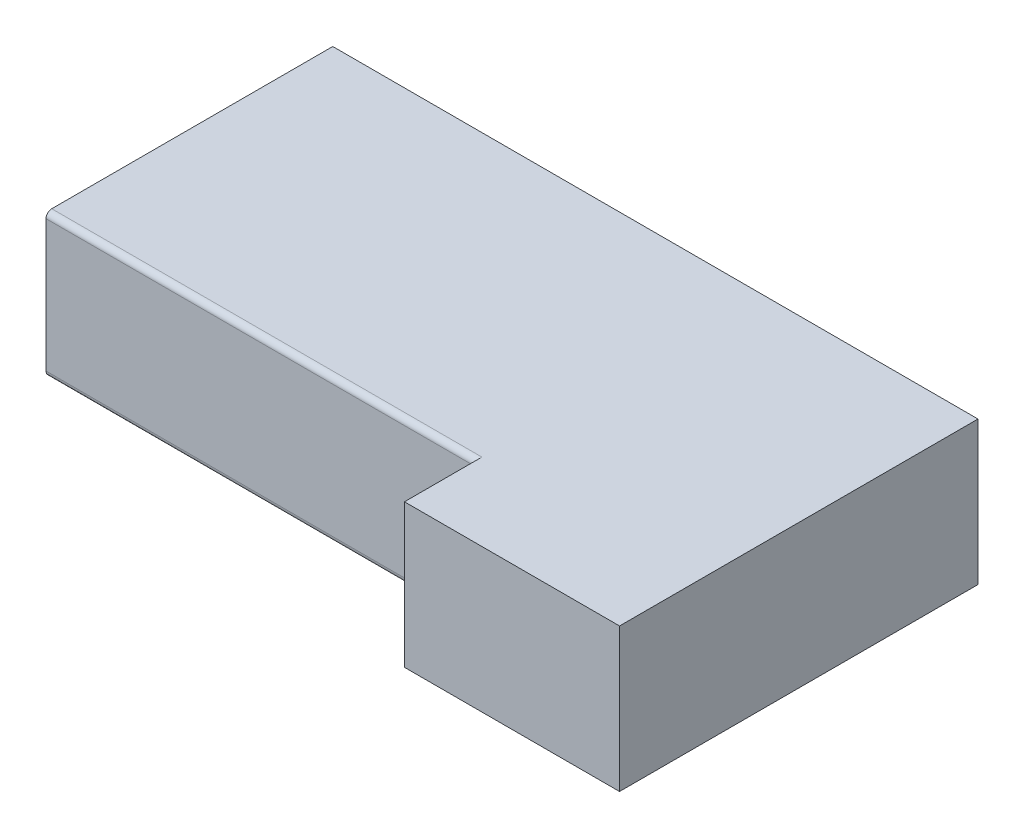
ISO-10303-21;
HEADER;
FILE_DESCRIPTION(('STEP AP214'),'2;1');
FILE_NAME('part.step','',(''),(''),'','','');
FILE_SCHEMA(('AUTOMOTIVE_DESIGN { 1 0 10303 214 1 1 1 1 }'));
ENDSEC;
DATA;
#1=APPLICATION_CONTEXT('core data for automotive mechanical design processes');
#2=APPLICATION_PROTOCOL_DEFINITION('international standard','automotive_design',2000,#1);
#3=PRODUCT_CONTEXT('',#1,'mechanical');
#4=PRODUCT('Part','Part','',(#3));
#5=PRODUCT_RELATED_PRODUCT_CATEGORY('part','',(#4));
#6=PRODUCT_DEFINITION_FORMATION('','',#4);
#7=PRODUCT_DEFINITION_CONTEXT('part definition',#1,'design');
#8=PRODUCT_DEFINITION('design','',#6,#7);
#9=PRODUCT_DEFINITION_SHAPE('','',#8);
#10=(LENGTH_UNIT() NAMED_UNIT(*) SI_UNIT(.MILLI.,.METRE.));
#11=(NAMED_UNIT(*) PLANE_ANGLE_UNIT() SI_UNIT($,.RADIAN.));
#12=(NAMED_UNIT(*) SI_UNIT($,.STERADIAN.) SOLID_ANGLE_UNIT());
#13=UNCERTAINTY_MEASURE_WITH_UNIT(LENGTH_MEASURE(1.E-05),#10,'distance_accuracy_value','');
#14=(GEOMETRIC_REPRESENTATION_CONTEXT(3) GLOBAL_UNCERTAINTY_ASSIGNED_CONTEXT((#13)) GLOBAL_UNIT_ASSIGNED_CONTEXT((#10,
#11,#12)) REPRESENTATION_CONTEXT('',''));
#15=CARTESIAN_POINT('',(0.,0.,0.));
#16=DIRECTION('',(0.,0.,1.));
#17=DIRECTION('',(1.,0.,0.));
#18=AXIS2_PLACEMENT_3D('',#15,#16,#17);
#19=CARTESIAN_POINT('',(-28.575,6.35,12.7));
#20=DIRECTION('',(0.,0.,-1.));
#21=DIRECTION('',(-1.,0.,0.));
#22=AXIS2_PLACEMENT_3D('',#19,#20,#21);
#23=PLANE('',#22);
#24=DIRECTION('',(0.,-1.,0.));
#25=VECTOR('',#24,1.);
#26=CARTESIAN_POINT('',(-28.575,6.35,12.7));
#27=LINE('',#26,#25);
#28=CARTESIAN_POINT('',(-28.575,5.842,12.7));
#29=VERTEX_POINT('',#28);
#30=CARTESIAN_POINT('',(-28.575,-5.842,12.7));
#31=VERTEX_POINT('',#30);
#32=EDGE_CURVE('E137',#29,#31,#27,.T.);
#33=ORIENTED_EDGE('',*,*,#32,.T.);
#34=DIRECTION('',(1.,0.,0.));
#35=VECTOR('',#34,1.);
#36=CARTESIAN_POINT('',(-28.575,-5.842,12.7));
#37=LINE('',#36,#35);
#38=CARTESIAN_POINT('',(9.525,-5.842,12.7));
#39=VERTEX_POINT('',#38);
#40=EDGE_CURVE('E151',#31,#39,#37,.T.);
#41=ORIENTED_EDGE('',*,*,#40,.T.);
#42=DIRECTION('',(0.,-1.,0.));
#43=VECTOR('',#42,1.);
#44=CARTESIAN_POINT('',(9.525,6.35,12.7));
#45=LINE('',#44,#43);
#46=CARTESIAN_POINT('',(9.525,5.842,12.7));
#47=VERTEX_POINT('',#46);
#48=EDGE_CURVE('E123',#47,#39,#45,.T.);
#49=ORIENTED_EDGE('',*,*,#48,.F.);
#50=DIRECTION('',(1.,0.,0.));
#51=VECTOR('',#50,1.);
#52=CARTESIAN_POINT('',(-28.575,5.842,12.7));
#53=LINE('',#52,#51);
#54=EDGE_CURVE('E149',#47,#29,#53,.F.);
#55=ORIENTED_EDGE('',*,*,#54,.T.);
#56=EDGE_LOOP('',(#33,#41,#49,#55));
#57=FACE_BOUND('',#56,.T.);
#58=ADVANCED_FACE('F33',(#57),#23,.F.);
#59=CARTESIAN_POINT('',(28.575,6.35,-12.7));
#60=DIRECTION('',(-1.,0.,0.));
#61=DIRECTION('',(0.,0.,1.));
#62=AXIS2_PLACEMENT_3D('',#59,#60,#61);
#63=PLANE('',#62);
#64=DIRECTION('',(0.,0.,-1.));
#65=VECTOR('',#64,1.);
#66=CARTESIAN_POINT('',(28.575,-6.35,-12.7));
#67=LINE('',#66,#65);
#68=CARTESIAN_POINT('',(28.575,-6.35,19.05));
#69=VERTEX_POINT('',#68);
#70=CARTESIAN_POINT('',(28.575,-6.35,-12.7));
#71=VERTEX_POINT('',#70);
#72=EDGE_CURVE('E132',#69,#71,#67,.T.);
#73=ORIENTED_EDGE('',*,*,#72,.T.);
#74=DIRECTION('',(0.,-1.,0.));
#75=VECTOR('',#74,1.);
#76=CARTESIAN_POINT('',(28.575,6.35,-12.7));
#77=LINE('',#76,#75);
#78=CARTESIAN_POINT('',(28.575,6.35,-12.7));
#79=VERTEX_POINT('',#78);
#80=EDGE_CURVE('E108',#79,#71,#77,.T.);
#81=ORIENTED_EDGE('',*,*,#80,.F.);
#82=DIRECTION('',(0.,0.,-1.));
#83=VECTOR('',#82,1.);
#84=CARTESIAN_POINT('',(28.575,6.35,-12.7));
#85=LINE('',#84,#83);
#86=CARTESIAN_POINT('',(28.575,6.35,19.05));
#87=VERTEX_POINT('',#86);
#88=EDGE_CURVE('E101',#87,#79,#85,.T.);
#89=ORIENTED_EDGE('',*,*,#88,.F.);
#90=DIRECTION('',(0.,1.,0.));
#91=VECTOR('',#90,1.);
#92=CARTESIAN_POINT('',(28.575,6.35,19.05));
#93=LINE('',#92,#91);
#94=EDGE_CURVE('E106',#69,#87,#93,.T.);
#95=ORIENTED_EDGE('',*,*,#94,.F.);
#96=EDGE_LOOP('',(#73,#81,#89,#95));
#97=FACE_BOUND('',#96,.T.);
#98=ADVANCED_FACE('F104',(#97),#63,.F.);
#99=CARTESIAN_POINT('',(-28.575,6.35,-12.7));
#100=DIRECTION('',(0.,0.,1.));
#101=DIRECTION('',(1.,0.,0.));
#102=AXIS2_PLACEMENT_3D('',#99,#100,#101);
#103=PLANE('',#102);
#104=DIRECTION('',(-1.,0.,0.));
#105=VECTOR('',#104,1.);
#106=CARTESIAN_POINT('',(-28.575,-6.35,-12.7));
#107=LINE('',#106,#105);
#108=CARTESIAN_POINT('',(-28.575,-6.35,-12.7));
#109=VERTEX_POINT('',#108);
#110=EDGE_CURVE('E139',#71,#109,#107,.T.);
#111=ORIENTED_EDGE('',*,*,#110,.T.);
#112=DIRECTION('',(0.,-1.,0.));
#113=VECTOR('',#112,1.);
#114=CARTESIAN_POINT('',(-28.575,6.35,-12.7));
#115=LINE('',#114,#113);
#116=CARTESIAN_POINT('',(-28.575,6.35,-12.7));
#117=VERTEX_POINT('',#116);
#118=EDGE_CURVE('E145',#117,#109,#115,.T.);
#119=ORIENTED_EDGE('',*,*,#118,.F.);
#120=DIRECTION('',(-1.,0.,0.));
#121=VECTOR('',#120,1.);
#122=CARTESIAN_POINT('',(-28.575,6.35,-12.7));
#123=LINE('',#122,#121);
#124=EDGE_CURVE('E110',#79,#117,#123,.T.);
#125=ORIENTED_EDGE('',*,*,#124,.F.);
#126=ORIENTED_EDGE('',*,*,#80,.T.);
#127=EDGE_LOOP('',(#111,#119,#125,#126));
#128=FACE_BOUND('',#127,.T.);
#129=ADVANCED_FACE('F175',(#128),#103,.F.);
#130=CARTESIAN_POINT('',(-28.575,6.35,-12.7));
#131=DIRECTION('',(1.,0.,0.));
#132=DIRECTION('',(0.,0.,-1.));
#133=AXIS2_PLACEMENT_3D('',#130,#131,#132);
#134=PLANE('',#133);
#135=DIRECTION('',(0.,0.,1.));
#136=VECTOR('',#135,1.);
#137=CARTESIAN_POINT('',(-28.575,-6.35,-12.7));
#138=LINE('',#137,#136);
#139=CARTESIAN_POINT('',(-28.575,-6.35,12.192));
#140=VERTEX_POINT('',#139);
#141=EDGE_CURVE('E111',#109,#140,#138,.T.);
#142=ORIENTED_EDGE('',*,*,#141,.T.);
#143=CARTESIAN_POINT('',(-28.575,-5.842,12.192));
#144=DIRECTION('',(1.,0.,0.));
#145=DIRECTION('',(0.,0.,-1.));
#146=AXIS2_PLACEMENT_3D('',#143,#144,#145);
#147=CIRCLE('',#146,0.508);
#148=EDGE_CURVE('E157',#140,#31,#147,.F.);
#149=ORIENTED_EDGE('',*,*,#148,.T.);
#150=ORIENTED_EDGE('',*,*,#32,.F.);
#151=CARTESIAN_POINT('',(-28.575,5.842,12.192));
#152=DIRECTION('',(1.,0.,0.));
#153=DIRECTION('',(0.,0.,-1.));
#154=AXIS2_PLACEMENT_3D('',#151,#152,#153);
#155=CIRCLE('',#154,0.508);
#156=CARTESIAN_POINT('',(-28.575,6.35,12.192));
#157=VERTEX_POINT('',#156);
#158=EDGE_CURVE('E55',#29,#157,#155,.F.);
#159=ORIENTED_EDGE('',*,*,#158,.T.);
#160=DIRECTION('',(0.,0.,1.));
#161=VECTOR('',#160,1.);
#162=CARTESIAN_POINT('',(-28.575,6.35,-12.7));
#163=LINE('',#162,#161);
#164=EDGE_CURVE('E135',#117,#157,#163,.T.);
#165=ORIENTED_EDGE('',*,*,#164,.F.);
#166=ORIENTED_EDGE('',*,*,#118,.T.);
#167=EDGE_LOOP('',(#142,#149,#150,#159,#165,#166));
#168=FACE_BOUND('',#167,.T.);
#169=ADVANCED_FACE('F172',(#168),#134,.F.);
#170=CARTESIAN_POINT('',(0.,6.35,0.));
#171=DIRECTION('',(0.,1.,0.));
#172=DIRECTION('',(0.,0.,1.));
#173=AXIS2_PLACEMENT_3D('',#170,#171,#172);
#174=PLANE('',#173);
#175=ORIENTED_EDGE('',*,*,#164,.T.);
#176=DIRECTION('',(1.,0.,0.));
#177=VECTOR('',#176,1.);
#178=CARTESIAN_POINT('',(9.525,6.35,12.192));
#179=LINE('',#178,#177);
#180=CARTESIAN_POINT('',(9.525,6.35,12.192));
#181=VERTEX_POINT('',#180);
#182=EDGE_CURVE('E159',#157,#181,#179,.T.);
#183=ORIENTED_EDGE('',*,*,#182,.T.);
#184=DIRECTION('',(0.,0.,-1.));
#185=VECTOR('',#184,1.);
#186=CARTESIAN_POINT('',(9.525,6.35,19.05));
#187=LINE('',#186,#185);
#188=CARTESIAN_POINT('',(9.525,6.35,19.05));
#189=VERTEX_POINT('',#188);
#190=EDGE_CURVE('E47',#189,#181,#187,.T.);
#191=ORIENTED_EDGE('',*,*,#190,.F.);
#192=DIRECTION('',(-1.,0.,0.));
#193=VECTOR('',#192,1.);
#194=CARTESIAN_POINT('',(28.575,6.35,19.05));
#195=LINE('',#194,#193);
#196=EDGE_CURVE('E113',#87,#189,#195,.T.);
#197=ORIENTED_EDGE('',*,*,#196,.F.);
#198=ORIENTED_EDGE('',*,*,#88,.T.);
#199=ORIENTED_EDGE('',*,*,#124,.T.);
#200=EDGE_LOOP('',(#175,#183,#191,#197,#198,#199));
#201=FACE_BOUND('',#200,.T.);
#202=ADVANCED_FACE('F114',(#201),#174,.T.);
#203=CARTESIAN_POINT('',(0.,-6.35,0.));
#204=DIRECTION('',(0.,1.,0.));
#205=DIRECTION('',(0.,0.,1.));
#206=AXIS2_PLACEMENT_3D('',#203,#204,#205);
#207=PLANE('',#206);
#208=DIRECTION('',(0.,0.,-1.));
#209=VECTOR('',#208,1.);
#210=CARTESIAN_POINT('',(9.525,-6.35,19.05));
#211=LINE('',#210,#209);
#212=CARTESIAN_POINT('',(9.525,-6.35,19.05));
#213=VERTEX_POINT('',#212);
#214=CARTESIAN_POINT('',(9.525,-6.35,12.192));
#215=VERTEX_POINT('',#214);
#216=EDGE_CURVE('E129',#213,#215,#211,.T.);
#217=ORIENTED_EDGE('',*,*,#216,.T.);
#218=DIRECTION('',(1.,0.,0.));
#219=VECTOR('',#218,1.);
#220=CARTESIAN_POINT('',(0.,-6.35,12.192));
#221=LINE('',#220,#219);
#222=EDGE_CURVE('E154',#215,#140,#221,.F.);
#223=ORIENTED_EDGE('',*,*,#222,.T.);
#224=ORIENTED_EDGE('',*,*,#141,.F.);
#225=ORIENTED_EDGE('',*,*,#110,.F.);
#226=ORIENTED_EDGE('',*,*,#72,.F.);
#227=DIRECTION('',(1.,0.,0.));
#228=VECTOR('',#227,1.);
#229=CARTESIAN_POINT('',(28.575,-6.35,19.05));
#230=LINE('',#229,#228);
#231=EDGE_CURVE('E122',#213,#69,#230,.T.);
#232=ORIENTED_EDGE('',*,*,#231,.F.);
#233=EDGE_LOOP('',(#217,#223,#224,#225,#226,#232));
#234=FACE_BOUND('',#233,.T.);
#235=ADVANCED_FACE('F171',(#234),#207,.F.);
#236=CARTESIAN_POINT('',(9.525,6.35,19.05));
#237=DIRECTION('',(1.,0.,0.));
#238=DIRECTION('',(0.,0.,-1.));
#239=AXIS2_PLACEMENT_3D('',#236,#237,#238);
#240=PLANE('',#239);
#241=ORIENTED_EDGE('',*,*,#190,.T.);
#242=CARTESIAN_POINT('',(9.525,5.842,12.192));
#243=DIRECTION('',(1.,0.,0.));
#244=DIRECTION('',(0.,0.,-1.));
#245=AXIS2_PLACEMENT_3D('',#242,#243,#244);
#246=CIRCLE('',#245,0.508);
#247=EDGE_CURVE('E11',#181,#47,#246,.T.);
#248=ORIENTED_EDGE('',*,*,#247,.T.);
#249=ORIENTED_EDGE('',*,*,#48,.T.);
#250=CARTESIAN_POINT('',(9.525,-5.842,12.192));
#251=DIRECTION('',(1.,0.,0.));
#252=DIRECTION('',(0.,0.,-1.));
#253=AXIS2_PLACEMENT_3D('',#250,#251,#252);
#254=CIRCLE('',#253,0.508);
#255=EDGE_CURVE('E41',#39,#215,#254,.T.);
#256=ORIENTED_EDGE('',*,*,#255,.T.);
#257=ORIENTED_EDGE('',*,*,#216,.F.);
#258=DIRECTION('',(0.,-1.,0.));
#259=VECTOR('',#258,1.);
#260=CARTESIAN_POINT('',(9.525,6.35,19.05));
#261=LINE('',#260,#259);
#262=EDGE_CURVE('E117',#189,#213,#261,.T.);
#263=ORIENTED_EDGE('',*,*,#262,.F.);
#264=EDGE_LOOP('',(#241,#248,#249,#256,#257,#263));
#265=FACE_BOUND('',#264,.T.);
#266=ADVANCED_FACE('F163',(#265),#240,.F.);
#267=CARTESIAN_POINT('',(0.,0.,19.05));
#268=DIRECTION('',(0.,0.,-1.));
#269=DIRECTION('',(-1.,0.,0.));
#270=AXIS2_PLACEMENT_3D('',#267,#268,#269);
#271=PLANE('',#270);
#272=ORIENTED_EDGE('',*,*,#94,.T.);
#273=ORIENTED_EDGE('',*,*,#196,.T.);
#274=ORIENTED_EDGE('',*,*,#262,.T.);
#275=ORIENTED_EDGE('',*,*,#231,.T.);
#276=EDGE_LOOP('',(#272,#273,#274,#275));
#277=FACE_BOUND('',#276,.T.);
#278=ADVANCED_FACE('F120',(#277),#271,.F.);
#279=CARTESIAN_POINT('',(-28.575,-5.842,12.192));
#280=DIRECTION('',(1.,0.,0.));
#281=DIRECTION('',(0.,0.,-1.));
#282=AXIS2_PLACEMENT_3D('',#279,#280,#281);
#283=CYLINDRICAL_SURFACE('',#282,0.508);
#284=ORIENTED_EDGE('',*,*,#148,.F.);
#285=ORIENTED_EDGE('',*,*,#222,.F.);
#286=ORIENTED_EDGE('',*,*,#255,.F.);
#287=ORIENTED_EDGE('',*,*,#40,.F.);
#288=EDGE_LOOP('',(#284,#285,#286,#287));
#289=FACE_BOUND('',#288,.T.);
#290=ADVANCED_FACE('F168',(#289),#283,.T.);
#291=CARTESIAN_POINT('',(0.,5.842,12.192));
#292=DIRECTION('',(-1.,0.,0.));
#293=DIRECTION('',(0.,0.,1.));
#294=AXIS2_PLACEMENT_3D('',#291,#292,#293);
#295=CYLINDRICAL_SURFACE('',#294,0.508);
#296=ORIENTED_EDGE('',*,*,#158,.F.);
#297=ORIENTED_EDGE('',*,*,#54,.F.);
#298=ORIENTED_EDGE('',*,*,#247,.F.);
#299=ORIENTED_EDGE('',*,*,#182,.F.);
#300=EDGE_LOOP('',(#296,#297,#298,#299));
#301=FACE_BOUND('',#300,.T.);
#302=ADVANCED_FACE('F35',(#301),#295,.T.);
#303=CLOSED_SHELL('',(#58,#98,#129,#169,#202,#235,#266,#278,#290,#302));
#304=MANIFOLD_SOLID_BREP('B2',#303);
#305=ADVANCED_BREP_SHAPE_REPRESENTATION('',(#18,#304),#14);
#306=SHAPE_DEFINITION_REPRESENTATION(#9,#305);
ENDSEC;
END-ISO-10303-21;
